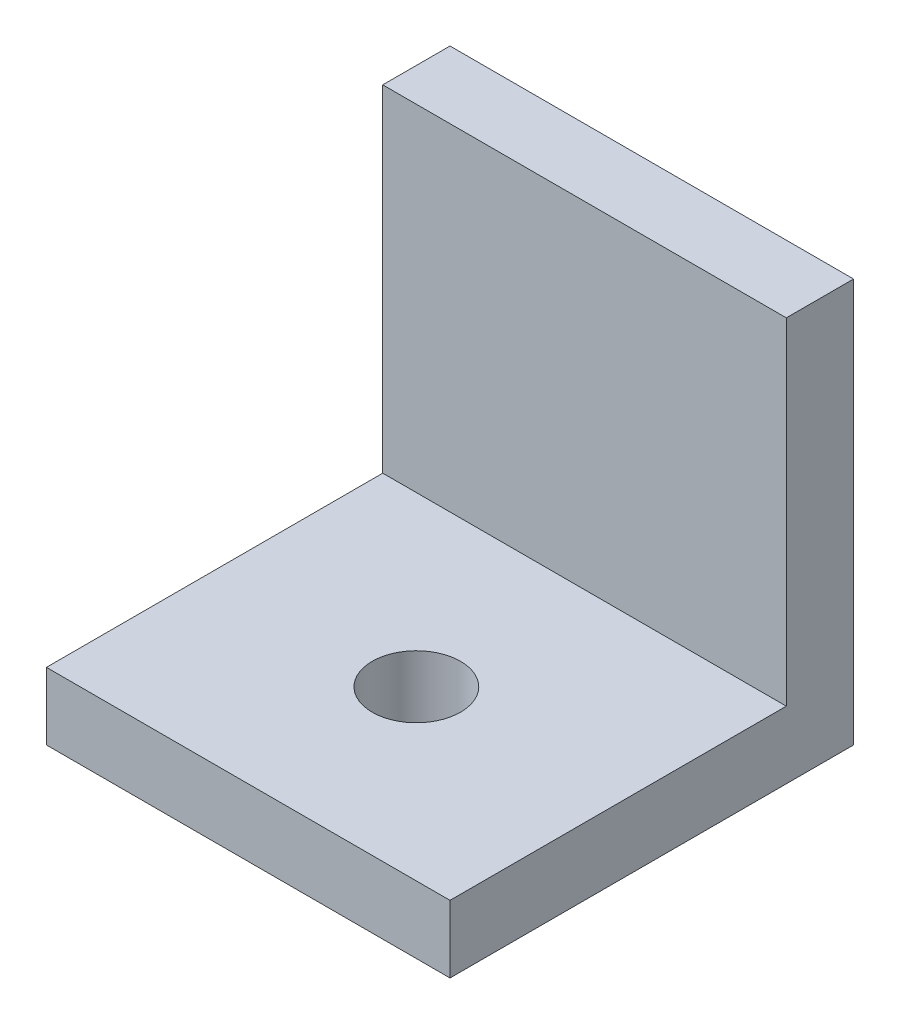
ISO-10303-21;
HEADER;
FILE_DESCRIPTION(('STEP AP214'),'2;1');
FILE_NAME('part.step','',(''),(''),'','','');
FILE_SCHEMA(('AUTOMOTIVE_DESIGN { 1 0 10303 214 1 1 1 1 }'));
ENDSEC;
DATA;
#1=APPLICATION_CONTEXT('core data for automotive mechanical design processes');
#2=APPLICATION_PROTOCOL_DEFINITION('international standard','automotive_design',2000,#1);
#3=PRODUCT_CONTEXT('',#1,'mechanical');
#4=PRODUCT('Part','Part','',(#3));
#5=PRODUCT_RELATED_PRODUCT_CATEGORY('part','',(#4));
#6=PRODUCT_DEFINITION_FORMATION('','',#4);
#7=PRODUCT_DEFINITION_CONTEXT('part definition',#1,'design');
#8=PRODUCT_DEFINITION('design','',#6,#7);
#9=PRODUCT_DEFINITION_SHAPE('','',#8);
#10=(LENGTH_UNIT() NAMED_UNIT(*) SI_UNIT(.MILLI.,.METRE.));
#11=(NAMED_UNIT(*) PLANE_ANGLE_UNIT() SI_UNIT($,.RADIAN.));
#12=(NAMED_UNIT(*) SI_UNIT($,.STERADIAN.) SOLID_ANGLE_UNIT());
#13=UNCERTAINTY_MEASURE_WITH_UNIT(LENGTH_MEASURE(1.E-05),#10,'distance_accuracy_value','');
#14=(GEOMETRIC_REPRESENTATION_CONTEXT(3) GLOBAL_UNCERTAINTY_ASSIGNED_CONTEXT((#13)) GLOBAL_UNIT_ASSIGNED_CONTEXT((#10,
#11,#12)) REPRESENTATION_CONTEXT('',''));
#15=CARTESIAN_POINT('',(0.,0.,0.));
#16=DIRECTION('',(0.,0.,1.));
#17=DIRECTION('',(1.,0.,0.));
#18=AXIS2_PLACEMENT_3D('',#15,#16,#17);
#19=CARTESIAN_POINT('',(76.2,0.,0.));
#20=DIRECTION('',(0.,0.,-1.));
#21=DIRECTION('',(-1.,0.,0.));
#22=AXIS2_PLACEMENT_3D('',#19,#20,#21);
#23=PLANE('',#22);
#24=DIRECTION('',(0.,-1.,0.));
#25=VECTOR('',#24,1.);
#26=CARTESIAN_POINT('',(0.,0.,0.));
#27=LINE('',#26,#25);
#28=CARTESIAN_POINT('',(0.,0.,0.));
#29=VERTEX_POINT('',#28);
#30=CARTESIAN_POINT('',(0.,-63.5,0.));
#31=VERTEX_POINT('',#30);
#32=EDGE_CURVE('E127',#29,#31,#27,.T.);
#33=ORIENTED_EDGE('',*,*,#32,.T.);
#34=DIRECTION('',(-1.,0.,0.));
#35=VECTOR('',#34,1.);
#36=CARTESIAN_POINT('',(76.2,-63.5,0.));
#37=LINE('',#36,#35);
#38=CARTESIAN_POINT('',(76.2,-63.5,0.));
#39=VERTEX_POINT('',#38);
#40=EDGE_CURVE('E11',#39,#31,#37,.T.);
#41=ORIENTED_EDGE('',*,*,#40,.F.);
#42=DIRECTION('',(0.,-1.,0.));
#43=VECTOR('',#42,1.);
#44=CARTESIAN_POINT('',(76.2,0.,0.));
#45=LINE('',#44,#43);
#46=CARTESIAN_POINT('',(76.2,0.,0.));
#47=VERTEX_POINT('',#46);
#48=EDGE_CURVE('E138',#47,#39,#45,.T.);
#49=ORIENTED_EDGE('',*,*,#48,.F.);
#50=DIRECTION('',(-1.,0.,0.));
#51=VECTOR('',#50,1.);
#52=CARTESIAN_POINT('',(76.2,0.,0.));
#53=LINE('',#52,#51);
#54=EDGE_CURVE('E123',#47,#29,#53,.T.);
#55=ORIENTED_EDGE('',*,*,#54,.T.);
#56=EDGE_LOOP('',(#33,#41,#49,#55));
#57=FACE_BOUND('',#56,.T.);
#58=ADVANCED_FACE('F43',(#57),#23,.F.);
#59=CARTESIAN_POINT('',(76.2,-63.5,0.));
#60=DIRECTION('',(0.,-1.,0.));
#61=DIRECTION('',(0.,0.,-1.));
#62=AXIS2_PLACEMENT_3D('',#59,#60,#61);
#63=PLANE('',#62);
#64=CARTESIAN_POINT('',(38.1,-63.5,31.75));
#65=DIRECTION('',(0.,1.,0.));
#66=DIRECTION('',(0.,0.,1.));
#67=AXIS2_PLACEMENT_3D('',#64,#65,#66);
#68=CIRCLE('',#67,8.334375);
#69=CARTESIAN_POINT('',(38.1,-63.5,40.084375));
#70=VERTEX_POINT('',#69);
#71=EDGE_CURVE('E182',#70,#70,#68,.T.);
#72=ORIENTED_EDGE('',*,*,#71,.F.);
#73=EDGE_LOOP('',(#72));
#74=FACE_BOUND('',#73,.T.);
#75=DIRECTION('',(0.,0.,1.));
#76=VECTOR('',#75,1.);
#77=CARTESIAN_POINT('',(0.,-63.5,0.));
#78=LINE('',#77,#76);
#79=CARTESIAN_POINT('',(0.,-63.5,63.5));
#80=VERTEX_POINT('',#79);
#81=EDGE_CURVE('E130',#31,#80,#78,.T.);
#82=ORIENTED_EDGE('',*,*,#81,.T.);
#83=DIRECTION('',(-1.,0.,0.));
#84=VECTOR('',#83,1.);
#85=CARTESIAN_POINT('',(76.2,-63.5,63.5));
#86=LINE('',#85,#84);
#87=CARTESIAN_POINT('',(76.2,-63.5,63.5));
#88=VERTEX_POINT('',#87);
#89=EDGE_CURVE('E51',#88,#80,#86,.T.);
#90=ORIENTED_EDGE('',*,*,#89,.F.);
#91=DIRECTION('',(0.,0.,1.));
#92=VECTOR('',#91,1.);
#93=CARTESIAN_POINT('',(76.2,-63.5,0.));
#94=LINE('',#93,#92);
#95=EDGE_CURVE('E96',#39,#88,#94,.T.);
#96=ORIENTED_EDGE('',*,*,#95,.F.);
#97=ORIENTED_EDGE('',*,*,#40,.T.);
#98=EDGE_LOOP('',(#82,#90,#96,#97));
#99=FACE_BOUND('',#98,.T.);
#100=ADVANCED_FACE('F162',(#74,#99),#63,.F.);
#101=CARTESIAN_POINT('',(76.2,-76.2,63.5));
#102=DIRECTION('',(0.,0.,-1.));
#103=DIRECTION('',(-1.,0.,0.));
#104=AXIS2_PLACEMENT_3D('',#101,#102,#103);
#105=PLANE('',#104);
#106=DIRECTION('',(0.,-1.,0.));
#107=VECTOR('',#106,1.);
#108=CARTESIAN_POINT('',(0.,-76.2,63.5));
#109=LINE('',#108,#107);
#110=CARTESIAN_POINT('',(0.,-76.2,63.5));
#111=VERTEX_POINT('',#110);
#112=EDGE_CURVE('E133',#80,#111,#109,.T.);
#113=ORIENTED_EDGE('',*,*,#112,.T.);
#114=DIRECTION('',(-1.,0.,0.));
#115=VECTOR('',#114,1.);
#116=CARTESIAN_POINT('',(76.2,-76.2,63.5));
#117=LINE('',#116,#115);
#118=CARTESIAN_POINT('',(76.2,-76.2,63.5));
#119=VERTEX_POINT('',#118);
#120=EDGE_CURVE('E118',#119,#111,#117,.T.);
#121=ORIENTED_EDGE('',*,*,#120,.F.);
#122=DIRECTION('',(0.,-1.,0.));
#123=VECTOR('',#122,1.);
#124=CARTESIAN_POINT('',(76.2,-76.2,63.5));
#125=LINE('',#124,#123);
#126=EDGE_CURVE('E109',#88,#119,#125,.T.);
#127=ORIENTED_EDGE('',*,*,#126,.F.);
#128=ORIENTED_EDGE('',*,*,#89,.T.);
#129=EDGE_LOOP('',(#113,#121,#127,#128));
#130=FACE_BOUND('',#129,.T.);
#131=ADVANCED_FACE('F144',(#130),#105,.F.);
#132=CARTESIAN_POINT('',(76.2,-76.2,-12.7));
#133=DIRECTION('',(0.,1.,0.));
#134=DIRECTION('',(0.,0.,1.));
#135=AXIS2_PLACEMENT_3D('',#132,#133,#134);
#136=PLANE('',#135);
#137=CARTESIAN_POINT('',(38.1,-76.2,31.75));
#138=DIRECTION('',(0.,1.,0.));
#139=DIRECTION('',(0.,0.,1.));
#140=AXIS2_PLACEMENT_3D('',#137,#138,#139);
#141=CIRCLE('',#140,8.334375);
#142=CARTESIAN_POINT('',(38.1,-76.2,40.084375));
#143=VERTEX_POINT('',#142);
#144=EDGE_CURVE('E131',#143,#143,#141,.T.);
#145=ORIENTED_EDGE('',*,*,#144,.T.);
#146=EDGE_LOOP('',(#145));
#147=FACE_BOUND('',#146,.T.);
#148=DIRECTION('',(0.,0.,-1.));
#149=VECTOR('',#148,1.);
#150=CARTESIAN_POINT('',(0.,-76.2,-12.7));
#151=LINE('',#150,#149);
#152=CARTESIAN_POINT('',(0.,-76.2,-12.7));
#153=VERTEX_POINT('',#152);
#154=EDGE_CURVE('E117',#111,#153,#151,.T.);
#155=ORIENTED_EDGE('',*,*,#154,.T.);
#156=DIRECTION('',(-1.,0.,0.));
#157=VECTOR('',#156,1.);
#158=CARTESIAN_POINT('',(76.2,-76.2,-12.7));
#159=LINE('',#158,#157);
#160=CARTESIAN_POINT('',(76.2,-76.2,-12.7));
#161=VERTEX_POINT('',#160);
#162=EDGE_CURVE('E114',#161,#153,#159,.T.);
#163=ORIENTED_EDGE('',*,*,#162,.F.);
#164=DIRECTION('',(0.,0.,-1.));
#165=VECTOR('',#164,1.);
#166=CARTESIAN_POINT('',(76.2,-76.2,-12.7));
#167=LINE('',#166,#165);
#168=EDGE_CURVE('E103',#119,#161,#167,.T.);
#169=ORIENTED_EDGE('',*,*,#168,.F.);
#170=ORIENTED_EDGE('',*,*,#120,.T.);
#171=EDGE_LOOP('',(#155,#163,#169,#170));
#172=FACE_BOUND('',#171,.T.);
#173=ADVANCED_FACE('F115',(#147,#172),#136,.F.);
#174=CARTESIAN_POINT('',(76.2,0.,-12.7));
#175=DIRECTION('',(0.,0.,1.));
#176=DIRECTION('',(0.,-1.,0.));
#177=AXIS2_PLACEMENT_3D('',#174,#175,#176);
#178=PLANE('',#177);
#179=DIRECTION('',(0.,1.,0.));
#180=VECTOR('',#179,1.);
#181=CARTESIAN_POINT('',(0.,0.,-12.7));
#182=LINE('',#181,#180);
#183=CARTESIAN_POINT('',(0.,0.,-12.7));
#184=VERTEX_POINT('',#183);
#185=EDGE_CURVE('E82',#153,#184,#182,.T.);
#186=ORIENTED_EDGE('',*,*,#185,.T.);
#187=DIRECTION('',(-1.,0.,0.));
#188=VECTOR('',#187,1.);
#189=CARTESIAN_POINT('',(76.2,0.,-12.7));
#190=LINE('',#189,#188);
#191=CARTESIAN_POINT('',(76.2,0.,-12.7));
#192=VERTEX_POINT('',#191);
#193=EDGE_CURVE('E119',#192,#184,#190,.T.);
#194=ORIENTED_EDGE('',*,*,#193,.F.);
#195=DIRECTION('',(0.,1.,0.));
#196=VECTOR('',#195,1.);
#197=CARTESIAN_POINT('',(76.2,0.,-12.7));
#198=LINE('',#197,#196);
#199=EDGE_CURVE('E107',#161,#192,#198,.T.);
#200=ORIENTED_EDGE('',*,*,#199,.F.);
#201=ORIENTED_EDGE('',*,*,#162,.T.);
#202=EDGE_LOOP('',(#186,#194,#200,#201));
#203=FACE_BOUND('',#202,.T.);
#204=ADVANCED_FACE('F121',(#203),#178,.F.);
#205=CARTESIAN_POINT('',(76.2,0.,0.));
#206=DIRECTION('',(0.,-1.,0.));
#207=DIRECTION('',(0.,0.,-1.));
#208=AXIS2_PLACEMENT_3D('',#205,#206,#207);
#209=PLANE('',#208);
#210=DIRECTION('',(0.,0.,1.));
#211=VECTOR('',#210,1.);
#212=CARTESIAN_POINT('',(0.,0.,0.));
#213=LINE('',#212,#211);
#214=EDGE_CURVE('E88',#184,#29,#213,.T.);
#215=ORIENTED_EDGE('',*,*,#214,.T.);
#216=ORIENTED_EDGE('',*,*,#54,.F.);
#217=DIRECTION('',(0.,0.,1.));
#218=VECTOR('',#217,1.);
#219=CARTESIAN_POINT('',(76.2,0.,0.));
#220=LINE('',#219,#218);
#221=EDGE_CURVE('E59',#192,#47,#220,.T.);
#222=ORIENTED_EDGE('',*,*,#221,.F.);
#223=ORIENTED_EDGE('',*,*,#193,.T.);
#224=EDGE_LOOP('',(#215,#216,#222,#223));
#225=FACE_BOUND('',#224,.T.);
#226=ADVANCED_FACE('F151',(#225),#209,.F.);
#227=CARTESIAN_POINT('',(76.2,0.,0.));
#228=DIRECTION('',(-1.,0.,0.));
#229=DIRECTION('',(0.,0.,1.));
#230=AXIS2_PLACEMENT_3D('',#227,#228,#229);
#231=PLANE('',#230);
#232=ORIENTED_EDGE('',*,*,#48,.T.);
#233=ORIENTED_EDGE('',*,*,#95,.T.);
#234=ORIENTED_EDGE('',*,*,#126,.T.);
#235=ORIENTED_EDGE('',*,*,#168,.T.);
#236=ORIENTED_EDGE('',*,*,#199,.T.);
#237=ORIENTED_EDGE('',*,*,#221,.T.);
#238=EDGE_LOOP('',(#232,#233,#234,#235,#236,#237));
#239=FACE_BOUND('',#238,.T.);
#240=ADVANCED_FACE('F105',(#239),#231,.F.);
#241=CARTESIAN_POINT('',(0.,0.,0.));
#242=DIRECTION('',(-1.,0.,0.));
#243=DIRECTION('',(0.,0.,1.));
#244=AXIS2_PLACEMENT_3D('',#241,#242,#243);
#245=PLANE('',#244);
#246=ORIENTED_EDGE('',*,*,#32,.F.);
#247=ORIENTED_EDGE('',*,*,#214,.F.);
#248=ORIENTED_EDGE('',*,*,#185,.F.);
#249=ORIENTED_EDGE('',*,*,#154,.F.);
#250=ORIENTED_EDGE('',*,*,#112,.F.);
#251=ORIENTED_EDGE('',*,*,#81,.F.);
#252=EDGE_LOOP('',(#246,#247,#248,#249,#250,#251));
#253=FACE_BOUND('',#252,.T.);
#254=ADVANCED_FACE('F147',(#253),#245,.T.);
#255=CARTESIAN_POINT('',(38.1,-76.2,31.75));
#256=DIRECTION('',(0.,1.,0.));
#257=DIRECTION('',(0.,0.,1.));
#258=AXIS2_PLACEMENT_3D('',#255,#256,#257);
#259=CYLINDRICAL_SURFACE('',#258,8.334375);
#260=ORIENTED_EDGE('',*,*,#144,.F.);
#261=EDGE_LOOP('',(#260));
#262=FACE_BOUND('',#261,.T.);
#263=ORIENTED_EDGE('',*,*,#71,.T.);
#264=EDGE_LOOP('',(#263));
#265=FACE_BOUND('',#264,.T.);
#266=ADVANCED_FACE('F189',(#262,#265),#259,.F.);
#267=CLOSED_SHELL('',(#58,#100,#131,#173,#204,#226,#240,#254,#266));
#268=MANIFOLD_SOLID_BREP('B2',#267);
#269=ADVANCED_BREP_SHAPE_REPRESENTATION('',(#18,#268),#14);
#270=SHAPE_DEFINITION_REPRESENTATION(#9,#269);
ENDSEC;
END-ISO-10303-21;
